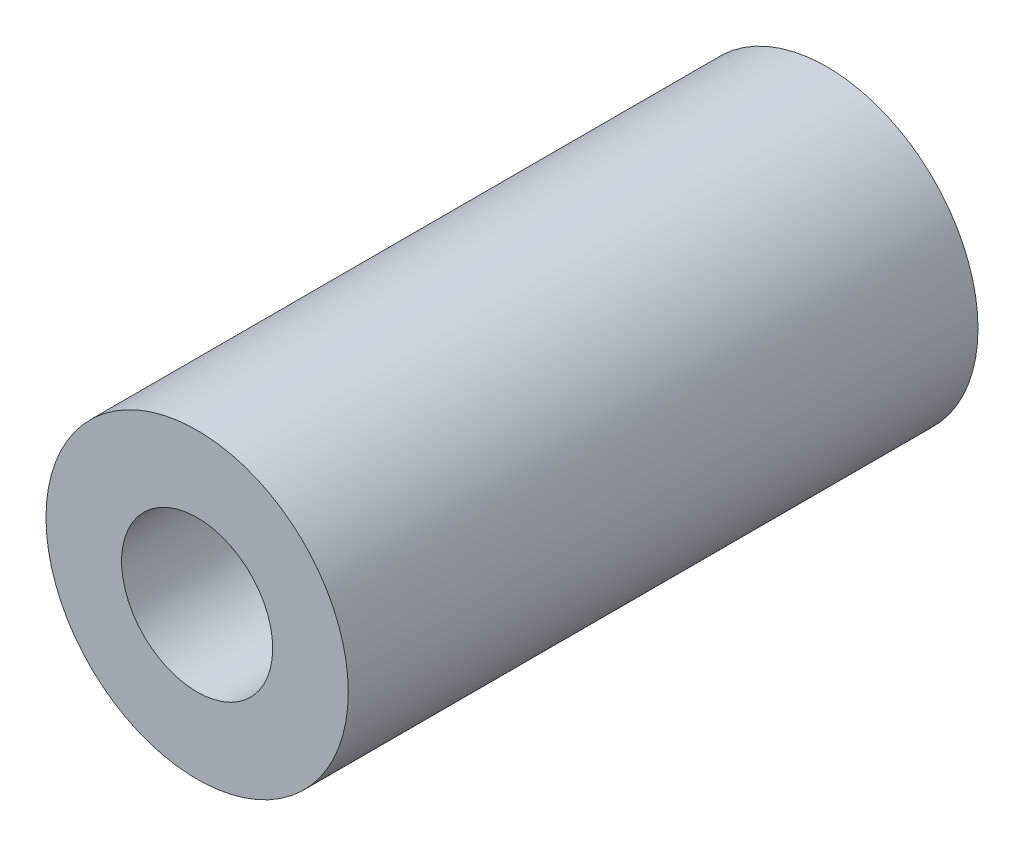
ISO-10303-21;
HEADER;
FILE_DESCRIPTION(('STEP AP214'),'2;1');
FILE_NAME('part.step','',(''),(''),'','','');
FILE_SCHEMA(('AUTOMOTIVE_DESIGN { 1 0 10303 214 1 1 1 1 }'));
ENDSEC;
DATA;
#1=APPLICATION_CONTEXT('core data for automotive mechanical design processes');
#2=APPLICATION_PROTOCOL_DEFINITION('international standard','automotive_design',2000,#1);
#3=PRODUCT_CONTEXT('',#1,'mechanical');
#4=PRODUCT('Part','Part','',(#3));
#5=PRODUCT_RELATED_PRODUCT_CATEGORY('part','',(#4));
#6=PRODUCT_DEFINITION_FORMATION('','',#4);
#7=PRODUCT_DEFINITION_CONTEXT('part definition',#1,'design');
#8=PRODUCT_DEFINITION('design','',#6,#7);
#9=PRODUCT_DEFINITION_SHAPE('','',#8);
#10=(LENGTH_UNIT() NAMED_UNIT(*) SI_UNIT(.MILLI.,.METRE.));
#11=(NAMED_UNIT(*) PLANE_ANGLE_UNIT() SI_UNIT($,.RADIAN.));
#12=(NAMED_UNIT(*) SI_UNIT($,.STERADIAN.) SOLID_ANGLE_UNIT());
#13=UNCERTAINTY_MEASURE_WITH_UNIT(LENGTH_MEASURE(1.E-05),#10,'distance_accuracy_value','');
#14=(GEOMETRIC_REPRESENTATION_CONTEXT(3) GLOBAL_UNCERTAINTY_ASSIGNED_CONTEXT((#13)) GLOBAL_UNIT_ASSIGNED_CONTEXT((#10,
#11,#12)) REPRESENTATION_CONTEXT('',''));
#15=CARTESIAN_POINT('',(0.,0.,0.));
#16=DIRECTION('',(0.,0.,1.));
#17=DIRECTION('',(1.,0.,0.));
#18=AXIS2_PLACEMENT_3D('',#15,#16,#17);
#19=CARTESIAN_POINT('',(0.,0.,25.));
#20=DIRECTION('',(0.,0.,1.));
#21=DIRECTION('',(1.,0.,0.));
#22=AXIS2_PLACEMENT_3D('',#19,#20,#21);
#23=PLANE('',#22);
#24=CARTESIAN_POINT('',(0.,0.,25.));
#25=DIRECTION('',(0.,0.,1.));
#26=DIRECTION('',(1.,0.,0.));
#27=AXIS2_PLACEMENT_3D('',#24,#25,#26);
#28=CIRCLE('',#27,6.);
#29=CARTESIAN_POINT('',(6.,0.,25.));
#30=VERTEX_POINT('',#29);
#31=EDGE_CURVE('E10',#30,#30,#28,.T.);
#32=ORIENTED_EDGE('',*,*,#31,.T.);
#33=EDGE_LOOP('',(#32));
#34=FACE_BOUND('',#33,.T.);
#35=CARTESIAN_POINT('',(0.,0.,25.));
#36=DIRECTION('',(0.,0.,1.));
#37=DIRECTION('',(1.,0.,0.));
#38=AXIS2_PLACEMENT_3D('',#35,#36,#37);
#39=CIRCLE('',#38,3.);
#40=CARTESIAN_POINT('',(3.,0.,25.));
#41=VERTEX_POINT('',#40);
#42=EDGE_CURVE('E48',#41,#41,#39,.T.);
#43=ORIENTED_EDGE('',*,*,#42,.F.);
#44=EDGE_LOOP('',(#43));
#45=FACE_BOUND('',#44,.T.);
#46=ADVANCED_FACE('F37',(#34,#45),#23,.T.);
#47=CARTESIAN_POINT('',(0.,0.,0.));
#48=DIRECTION('',(0.,0.,1.));
#49=DIRECTION('',(1.,0.,0.));
#50=AXIS2_PLACEMENT_3D('',#47,#48,#49);
#51=PLANE('',#50);
#52=CARTESIAN_POINT('',(0.,0.,0.));
#53=DIRECTION('',(0.,0.,1.));
#54=DIRECTION('',(1.,0.,0.));
#55=AXIS2_PLACEMENT_3D('',#52,#53,#54);
#56=CIRCLE('',#55,6.);
#57=CARTESIAN_POINT('',(6.,0.,0.));
#58=VERTEX_POINT('',#57);
#59=EDGE_CURVE('E41',#58,#58,#56,.T.);
#60=ORIENTED_EDGE('',*,*,#59,.F.);
#61=EDGE_LOOP('',(#60));
#62=FACE_BOUND('',#61,.T.);
#63=CARTESIAN_POINT('',(0.,0.,0.));
#64=DIRECTION('',(0.,0.,1.));
#65=DIRECTION('',(1.,0.,0.));
#66=AXIS2_PLACEMENT_3D('',#63,#64,#65);
#67=CIRCLE('',#66,3.);
#68=CARTESIAN_POINT('',(3.,0.,0.));
#69=VERTEX_POINT('',#68);
#70=EDGE_CURVE('E50',#69,#69,#67,.T.);
#71=ORIENTED_EDGE('',*,*,#70,.T.);
#72=EDGE_LOOP('',(#71));
#73=FACE_BOUND('',#72,.T.);
#74=ADVANCED_FACE('F60',(#62,#73),#51,.F.);
#75=CARTESIAN_POINT('',(0.,0.,25.));
#76=DIRECTION('',(0.,0.,-1.));
#77=DIRECTION('',(-1.,0.,0.));
#78=AXIS2_PLACEMENT_3D('',#75,#76,#77);
#79=CYLINDRICAL_SURFACE('',#78,6.);
#80=ORIENTED_EDGE('',*,*,#31,.F.);
#81=EDGE_LOOP('',(#80));
#82=FACE_BOUND('',#81,.T.);
#83=ORIENTED_EDGE('',*,*,#59,.T.);
#84=EDGE_LOOP('',(#83));
#85=FACE_BOUND('',#84,.T.);
#86=ADVANCED_FACE('F39',(#82,#85),#79,.T.);
#87=CARTESIAN_POINT('',(0.,0.,25.));
#88=DIRECTION('',(0.,0.,-1.));
#89=DIRECTION('',(-1.,0.,0.));
#90=AXIS2_PLACEMENT_3D('',#87,#88,#89);
#91=CYLINDRICAL_SURFACE('',#90,3.);
#92=ORIENTED_EDGE('',*,*,#42,.T.);
#93=EDGE_LOOP('',(#92));
#94=FACE_BOUND('',#93,.T.);
#95=ORIENTED_EDGE('',*,*,#70,.F.);
#96=EDGE_LOOP('',(#95));
#97=FACE_BOUND('',#96,.T.);
#98=ADVANCED_FACE('F56',(#94,#97),#91,.F.);
#99=CLOSED_SHELL('',(#46,#74,#86,#98));
#100=MANIFOLD_SOLID_BREP('B2',#99);
#101=ADVANCED_BREP_SHAPE_REPRESENTATION('',(#18,#100),#14);
#102=SHAPE_DEFINITION_REPRESENTATION(#9,#101);
ENDSEC;
END-ISO-10303-21;
